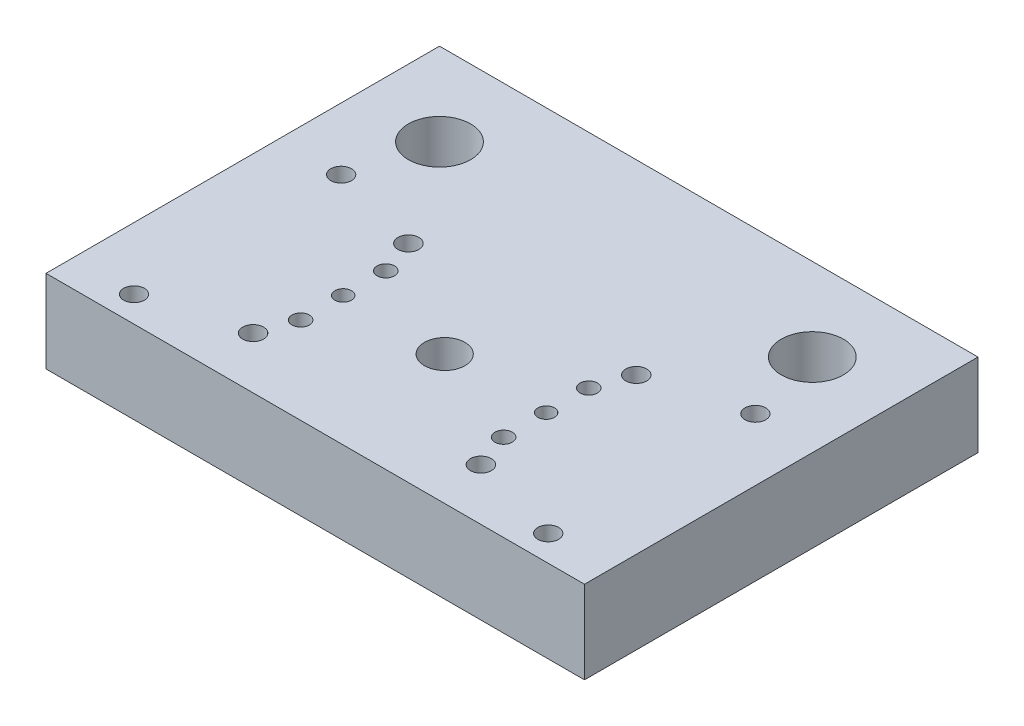
ISO-10303-21;
HEADER;
FILE_DESCRIPTION(('STEP AP214'),'2;1');
FILE_NAME('part.step','',(''),(''),'','','');
FILE_SCHEMA(('AUTOMOTIVE_DESIGN { 1 0 10303 214 1 1 1 1 }'));
ENDSEC;
DATA;
#1=APPLICATION_CONTEXT('core data for automotive mechanical design processes');
#2=APPLICATION_PROTOCOL_DEFINITION('international standard','automotive_design',2000,#1);
#3=PRODUCT_CONTEXT('',#1,'mechanical');
#4=PRODUCT('Part','Part','',(#3));
#5=PRODUCT_RELATED_PRODUCT_CATEGORY('part','',(#4));
#6=PRODUCT_DEFINITION_FORMATION('','',#4);
#7=PRODUCT_DEFINITION_CONTEXT('part definition',#1,'design');
#8=PRODUCT_DEFINITION('design','',#6,#7);
#9=PRODUCT_DEFINITION_SHAPE('','',#8);
#10=(LENGTH_UNIT() NAMED_UNIT(*) SI_UNIT(.MILLI.,.METRE.));
#11=(NAMED_UNIT(*) PLANE_ANGLE_UNIT() SI_UNIT($,.RADIAN.));
#12=(NAMED_UNIT(*) SI_UNIT($,.STERADIAN.) SOLID_ANGLE_UNIT());
#13=UNCERTAINTY_MEASURE_WITH_UNIT(LENGTH_MEASURE(1.E-05),#10,'distance_accuracy_value','');
#14=(GEOMETRIC_REPRESENTATION_CONTEXT(3) GLOBAL_UNCERTAINTY_ASSIGNED_CONTEXT((#13)) GLOBAL_UNIT_ASSIGNED_CONTEXT((#10,
#11,#12)) REPRESENTATION_CONTEXT('',''));
#15=CARTESIAN_POINT('',(0.,0.,0.));
#16=DIRECTION('',(0.,0.,1.));
#17=DIRECTION('',(1.,0.,0.));
#18=AXIS2_PLACEMENT_3D('',#15,#16,#17);
#19=CARTESIAN_POINT('',(-100.,-40.,-17.5));
#20=DIRECTION('',(0.,-1.,0.));
#21=DIRECTION('',(0.,0.,-1.));
#22=AXIS2_PLACEMENT_3D('',#19,#20,#21);
#23=CYLINDRICAL_SURFACE('',#22,5.);
#24=CARTESIAN_POINT('',(-100.,0.,-17.5));
#25=DIRECTION('',(0.,-1.,0.));
#26=DIRECTION('',(0.,0.,-1.));
#27=AXIS2_PLACEMENT_3D('',#24,#25,#26);
#28=CIRCLE('',#27,4.99999999999999);
#29=CARTESIAN_POINT('',(-100.,0.,-22.5));
#30=VERTEX_POINT('',#29);
#31=EDGE_CURVE('E175',#30,#30,#28,.T.);
#32=ORIENTED_EDGE('',*,*,#31,.F.);
#33=EDGE_LOOP('',(#32));
#34=FACE_BOUND('',#33,.T.);
#35=CARTESIAN_POINT('',(-100.,-8.1,-17.5));
#36=DIRECTION('',(0.,-1.,0.));
#37=DIRECTION('',(0.,0.,-1.));
#38=AXIS2_PLACEMENT_3D('',#35,#36,#37);
#39=CIRCLE('',#38,5.);
#40=CARTESIAN_POINT('',(-100.,-8.1,-22.5));
#41=VERTEX_POINT('',#40);
#42=EDGE_CURVE('E49',#41,#41,#39,.F.);
#43=ORIENTED_EDGE('',*,*,#42,.F.);
#44=EDGE_LOOP('',(#43));
#45=FACE_BOUND('',#44,.T.);
#46=ADVANCED_FACE('F45',(#34,#45),#23,.F.);
#47=CARTESIAN_POINT('',(-100.,-40.,82.5));
#48=DIRECTION('',(0.,-1.,0.));
#49=DIRECTION('',(0.,0.,-1.));
#50=AXIS2_PLACEMENT_3D('',#47,#48,#49);
#51=CYLINDRICAL_SURFACE('',#50,5.);
#52=CARTESIAN_POINT('',(-100.,0.,82.5));
#53=DIRECTION('',(0.,-1.,0.));
#54=DIRECTION('',(0.,0.,-1.));
#55=AXIS2_PLACEMENT_3D('',#52,#53,#54);
#56=CIRCLE('',#55,4.99999999999999);
#57=CARTESIAN_POINT('',(-100.,0.,77.5));
#58=VERTEX_POINT('',#57);
#59=EDGE_CURVE('E166',#58,#58,#56,.T.);
#60=ORIENTED_EDGE('',*,*,#59,.F.);
#61=EDGE_LOOP('',(#60));
#62=FACE_BOUND('',#61,.T.);
#63=CARTESIAN_POINT('',(-100.,-8.1,82.5));
#64=DIRECTION('',(0.,-1.,0.));
#65=DIRECTION('',(0.,0.,-1.));
#66=AXIS2_PLACEMENT_3D('',#63,#64,#65);
#67=CIRCLE('',#66,5.);
#68=CARTESIAN_POINT('',(-100.,-8.1,77.5));
#69=VERTEX_POINT('',#68);
#70=EDGE_CURVE('E145',#69,#69,#67,.F.);
#71=ORIENTED_EDGE('',*,*,#70,.F.);
#72=EDGE_LOOP('',(#71));
#73=FACE_BOUND('',#72,.T.);
#74=ADVANCED_FACE('F337',(#62,#73),#51,.F.);
#75=CARTESIAN_POINT('',(100.,-40.,82.5));
#76=DIRECTION('',(0.,-1.,0.));
#77=DIRECTION('',(0.,0.,-1.));
#78=AXIS2_PLACEMENT_3D('',#75,#76,#77);
#79=CYLINDRICAL_SURFACE('',#78,5.);
#80=CARTESIAN_POINT('',(100.,0.,82.5));
#81=DIRECTION('',(0.,-1.,0.));
#82=DIRECTION('',(0.,0.,-1.));
#83=AXIS2_PLACEMENT_3D('',#80,#81,#82);
#84=CIRCLE('',#83,4.99999999999999);
#85=CARTESIAN_POINT('',(100.,0.,77.5));
#86=VERTEX_POINT('',#85);
#87=EDGE_CURVE('E159',#86,#86,#84,.T.);
#88=ORIENTED_EDGE('',*,*,#87,.F.);
#89=EDGE_LOOP('',(#88));
#90=FACE_BOUND('',#89,.T.);
#91=CARTESIAN_POINT('',(100.,-8.1,82.5));
#92=DIRECTION('',(0.,-1.,0.));
#93=DIRECTION('',(0.,0.,-1.));
#94=AXIS2_PLACEMENT_3D('',#91,#92,#93);
#95=CIRCLE('',#94,5.);
#96=CARTESIAN_POINT('',(100.,-8.1,77.5));
#97=VERTEX_POINT('',#96);
#98=EDGE_CURVE('E141',#97,#97,#95,.F.);
#99=ORIENTED_EDGE('',*,*,#98,.F.);
#100=EDGE_LOOP('',(#99));
#101=FACE_BOUND('',#100,.T.);
#102=ADVANCED_FACE('F343',(#90,#101),#79,.F.);
#103=CARTESIAN_POINT('',(100.,-40.,-17.5));
#104=DIRECTION('',(0.,-1.,0.));
#105=DIRECTION('',(0.,0.,-1.));
#106=AXIS2_PLACEMENT_3D('',#103,#104,#105);
#107=CYLINDRICAL_SURFACE('',#106,5.);
#108=CARTESIAN_POINT('',(100.,0.,-17.5));
#109=DIRECTION('',(0.,-1.,0.));
#110=DIRECTION('',(0.,0.,-1.));
#111=AXIS2_PLACEMENT_3D('',#108,#109,#110);
#112=CIRCLE('',#111,4.99999999999999);
#113=CARTESIAN_POINT('',(100.,0.,-22.5));
#114=VERTEX_POINT('',#113);
#115=EDGE_CURVE('E153',#114,#114,#112,.T.);
#116=ORIENTED_EDGE('',*,*,#115,.F.);
#117=EDGE_LOOP('',(#116));
#118=FACE_BOUND('',#117,.T.);
#119=CARTESIAN_POINT('',(100.,-8.1,-17.5));
#120=DIRECTION('',(0.,-1.,0.));
#121=DIRECTION('',(0.,0.,-1.));
#122=AXIS2_PLACEMENT_3D('',#119,#120,#121);
#123=CIRCLE('',#122,5.);
#124=CARTESIAN_POINT('',(100.,-8.1,-22.5));
#125=VERTEX_POINT('',#124);
#126=EDGE_CURVE('E137',#125,#125,#123,.F.);
#127=ORIENTED_EDGE('',*,*,#126,.F.);
#128=EDGE_LOOP('',(#127));
#129=FACE_BOUND('',#128,.T.);
#130=ADVANCED_FACE('F335',(#118,#129),#107,.F.);
#131=CARTESIAN_POINT('',(130.,-40.,95.));
#132=DIRECTION('',(1.,0.,0.));
#133=DIRECTION('',(0.,0.,-1.));
#134=AXIS2_PLACEMENT_3D('',#131,#132,#133);
#135=PLANE('',#134);
#136=DIRECTION('',(0.,0.,-1.));
#137=VECTOR('',#136,1.);
#138=CARTESIAN_POINT('',(130.,0.,95.));
#139=LINE('',#138,#137);
#140=CARTESIAN_POINT('',(130.,0.,95.));
#141=VERTEX_POINT('',#140);
#142=CARTESIAN_POINT('',(130.,0.,-95.));
#143=VERTEX_POINT('',#142);
#144=EDGE_CURVE('E120',#141,#143,#139,.T.);
#145=ORIENTED_EDGE('',*,*,#144,.F.);
#146=DIRECTION('',(0.,1.,0.));
#147=VECTOR('',#146,1.);
#148=CARTESIAN_POINT('',(130.,-40.,95.));
#149=LINE('',#148,#147);
#150=CARTESIAN_POINT('',(130.,-40.,95.));
#151=VERTEX_POINT('',#150);
#152=EDGE_CURVE('E11',#151,#141,#149,.T.);
#153=ORIENTED_EDGE('',*,*,#152,.F.);
#154=DIRECTION('',(0.,0.,-1.));
#155=VECTOR('',#154,1.);
#156=CARTESIAN_POINT('',(130.,-40.,95.));
#157=LINE('',#156,#155);
#158=CARTESIAN_POINT('',(130.,-40.,-95.));
#159=VERTEX_POINT('',#158);
#160=EDGE_CURVE('E110',#151,#159,#157,.T.);
#161=ORIENTED_EDGE('',*,*,#160,.T.);
#162=DIRECTION('',(0.,1.,0.));
#163=VECTOR('',#162,1.);
#164=CARTESIAN_POINT('',(130.,-40.,-95.));
#165=LINE('',#164,#163);
#166=EDGE_CURVE('E90',#159,#143,#165,.T.);
#167=ORIENTED_EDGE('',*,*,#166,.T.);
#168=EDGE_LOOP('',(#145,#153,#161,#167));
#169=FACE_BOUND('',#168,.T.);
#170=ADVANCED_FACE('F47',(#169),#135,.T.);
#171=CARTESIAN_POINT('',(-130.,-40.,95.));
#172=DIRECTION('',(0.,0.,1.));
#173=DIRECTION('',(1.,0.,0.));
#174=AXIS2_PLACEMENT_3D('',#171,#172,#173);
#175=PLANE('',#174);
#176=DIRECTION('',(1.,0.,0.));
#177=VECTOR('',#176,1.);
#178=CARTESIAN_POINT('',(-130.,0.,95.));
#179=LINE('',#178,#177);
#180=CARTESIAN_POINT('',(-130.,0.,95.));
#181=VERTEX_POINT('',#180);
#182=EDGE_CURVE('E114',#181,#141,#179,.T.);
#183=ORIENTED_EDGE('',*,*,#182,.F.);
#184=DIRECTION('',(0.,1.,0.));
#185=VECTOR('',#184,1.);
#186=CARTESIAN_POINT('',(-130.,-40.,95.));
#187=LINE('',#186,#185);
#188=CARTESIAN_POINT('',(-130.,-40.,95.));
#189=VERTEX_POINT('',#188);
#190=EDGE_CURVE('E56',#189,#181,#187,.T.);
#191=ORIENTED_EDGE('',*,*,#190,.F.);
#192=DIRECTION('',(1.,0.,0.));
#193=VECTOR('',#192,1.);
#194=CARTESIAN_POINT('',(-130.,-40.,95.));
#195=LINE('',#194,#193);
#196=EDGE_CURVE('E105',#189,#151,#195,.T.);
#197=ORIENTED_EDGE('',*,*,#196,.T.);
#198=ORIENTED_EDGE('',*,*,#152,.T.);
#199=EDGE_LOOP('',(#183,#191,#197,#198));
#200=FACE_BOUND('',#199,.T.);
#201=ADVANCED_FACE('F327',(#200),#175,.T.);
#202=CARTESIAN_POINT('',(-130.,-40.,95.));
#203=DIRECTION('',(-1.,0.,0.));
#204=DIRECTION('',(0.,0.,1.));
#205=AXIS2_PLACEMENT_3D('',#202,#203,#204);
#206=PLANE('',#205);
#207=DIRECTION('',(0.,0.,1.));
#208=VECTOR('',#207,1.);
#209=CARTESIAN_POINT('',(-130.,0.,95.));
#210=LINE('',#209,#208);
#211=CARTESIAN_POINT('',(-130.,0.,-95.));
#212=VERTEX_POINT('',#211);
#213=EDGE_CURVE('E98',#212,#181,#210,.T.);
#214=ORIENTED_EDGE('',*,*,#213,.F.);
#215=DIRECTION('',(0.,1.,0.));
#216=VECTOR('',#215,1.);
#217=CARTESIAN_POINT('',(-130.,-40.,-95.));
#218=LINE('',#217,#216);
#219=CARTESIAN_POINT('',(-130.,-40.,-95.));
#220=VERTEX_POINT('',#219);
#221=EDGE_CURVE('E93',#220,#212,#218,.T.);
#222=ORIENTED_EDGE('',*,*,#221,.F.);
#223=DIRECTION('',(0.,0.,1.));
#224=VECTOR('',#223,1.);
#225=CARTESIAN_POINT('',(-130.,-40.,95.));
#226=LINE('',#225,#224);
#227=EDGE_CURVE('E96',#220,#189,#226,.T.);
#228=ORIENTED_EDGE('',*,*,#227,.T.);
#229=ORIENTED_EDGE('',*,*,#190,.T.);
#230=EDGE_LOOP('',(#214,#222,#228,#229));
#231=FACE_BOUND('',#230,.T.);
#232=ADVANCED_FACE('F95',(#231),#206,.T.);
#233=CARTESIAN_POINT('',(-130.,-40.,-95.));
#234=DIRECTION('',(0.,0.,-1.));
#235=DIRECTION('',(-1.,0.,0.));
#236=AXIS2_PLACEMENT_3D('',#233,#234,#235);
#237=PLANE('',#236);
#238=DIRECTION('',(-1.,0.,0.));
#239=VECTOR('',#238,1.);
#240=CARTESIAN_POINT('',(-130.,0.,-95.));
#241=LINE('',#240,#239);
#242=EDGE_CURVE('E124',#143,#212,#241,.T.);
#243=ORIENTED_EDGE('',*,*,#242,.F.);
#244=ORIENTED_EDGE('',*,*,#166,.F.);
#245=DIRECTION('',(-1.,0.,0.));
#246=VECTOR('',#245,1.);
#247=CARTESIAN_POINT('',(-130.,-40.,-95.));
#248=LINE('',#247,#246);
#249=EDGE_CURVE('E104',#159,#220,#248,.T.);
#250=ORIENTED_EDGE('',*,*,#249,.T.);
#251=ORIENTED_EDGE('',*,*,#221,.T.);
#252=EDGE_LOOP('',(#243,#244,#250,#251));
#253=FACE_BOUND('',#252,.T.);
#254=ADVANCED_FACE('F108',(#253),#237,.T.);
#255=CARTESIAN_POINT('',(0.,-40.,0.));
#256=DIRECTION('',(0.,-1.,0.));
#257=DIRECTION('',(0.,0.,-1.));
#258=AXIS2_PLACEMENT_3D('',#255,#256,#257);
#259=PLANE('',#258);
#260=CARTESIAN_POINT('',(-100.,-40.,-17.5));
#261=DIRECTION('',(0.,-1.,0.));
#262=DIRECTION('',(0.,0.,-1.));
#263=AXIS2_PLACEMENT_3D('',#260,#261,#262);
#264=CIRCLE('',#263,8.50000000000001);
#265=CARTESIAN_POINT('',(-100.,-40.,-26.));
#266=VERTEX_POINT('',#265);
#267=EDGE_CURVE('E440',#266,#266,#264,.T.);
#268=ORIENTED_EDGE('',*,*,#267,.F.);
#269=EDGE_LOOP('',(#268));
#270=FACE_BOUND('',#269,.T.);
#271=CARTESIAN_POINT('',(100.,-40.,-17.5));
#272=DIRECTION('',(0.,-1.,0.));
#273=DIRECTION('',(0.,0.,-1.));
#274=AXIS2_PLACEMENT_3D('',#271,#272,#273);
#275=CIRCLE('',#274,8.50000000000001);
#276=CARTESIAN_POINT('',(100.,-40.,-26.));
#277=VERTEX_POINT('',#276);
#278=EDGE_CURVE('E444',#277,#277,#275,.T.);
#279=ORIENTED_EDGE('',*,*,#278,.F.);
#280=EDGE_LOOP('',(#279));
#281=FACE_BOUND('',#280,.T.);
#282=CARTESIAN_POINT('',(100.,-40.,82.5));
#283=DIRECTION('',(0.,-1.,0.));
#284=DIRECTION('',(0.,0.,-1.));
#285=AXIS2_PLACEMENT_3D('',#282,#283,#284);
#286=CIRCLE('',#285,8.50000000000001);
#287=CARTESIAN_POINT('',(100.,-40.,74.));
#288=VERTEX_POINT('',#287);
#289=EDGE_CURVE('E448',#288,#288,#286,.T.);
#290=ORIENTED_EDGE('',*,*,#289,.F.);
#291=EDGE_LOOP('',(#290));
#292=FACE_BOUND('',#291,.T.);
#293=CARTESIAN_POINT('',(-100.,-40.,82.5));
#294=DIRECTION('',(0.,-1.,0.));
#295=DIRECTION('',(0.,0.,-1.));
#296=AXIS2_PLACEMENT_3D('',#293,#294,#295);
#297=CIRCLE('',#296,8.50000000000001);
#298=CARTESIAN_POINT('',(-100.,-40.,74.));
#299=VERTEX_POINT('',#298);
#300=EDGE_CURVE('E169',#299,#299,#297,.T.);
#301=ORIENTED_EDGE('',*,*,#300,.F.);
#302=EDGE_LOOP('',(#301));
#303=FACE_BOUND('',#302,.T.);
#304=CARTESIAN_POINT('',(49.,-40.,32.5));
#305=DIRECTION('',(0.,-1.,0.));
#306=DIRECTION('',(0.,0.,-1.));
#307=AXIS2_PLACEMENT_3D('',#304,#305,#306);
#308=CIRCLE('',#307,4.);
#309=CARTESIAN_POINT('',(49.,-40.,28.5));
#310=VERTEX_POINT('',#309);
#311=EDGE_CURVE('E179',#310,#310,#308,.T.);
#312=ORIENTED_EDGE('',*,*,#311,.F.);
#313=EDGE_LOOP('',(#312));
#314=FACE_BOUND('',#313,.T.);
#315=CARTESIAN_POINT('',(-49.,-40.,32.5));
#316=DIRECTION('',(0.,-1.,0.));
#317=DIRECTION('',(0.,0.,-1.));
#318=AXIS2_PLACEMENT_3D('',#315,#316,#317);
#319=CIRCLE('',#318,4.);
#320=CARTESIAN_POINT('',(-49.,-40.,28.5));
#321=VERTEX_POINT('',#320);
#322=EDGE_CURVE('E187',#321,#321,#319,.T.);
#323=ORIENTED_EDGE('',*,*,#322,.F.);
#324=EDGE_LOOP('',(#323));
#325=FACE_BOUND('',#324,.T.);
#326=CARTESIAN_POINT('',(49.,-40.,11.95));
#327=DIRECTION('',(0.,-1.,0.));
#328=DIRECTION('',(0.,0.,-1.));
#329=AXIS2_PLACEMENT_3D('',#326,#327,#328);
#330=CIRCLE('',#329,7.5);
#331=CARTESIAN_POINT('',(49.,-40.,4.44999999999999));
#332=VERTEX_POINT('',#331);
#333=EDGE_CURVE('E195',#332,#332,#330,.T.);
#334=ORIENTED_EDGE('',*,*,#333,.F.);
#335=EDGE_LOOP('',(#334));
#336=FACE_BOUND('',#335,.T.);
#337=CARTESIAN_POINT('',(49.,-40.,53.05));
#338=DIRECTION('',(0.,-1.,0.));
#339=DIRECTION('',(0.,0.,-1.));
#340=AXIS2_PLACEMENT_3D('',#337,#338,#339);
#341=CIRCLE('',#340,7.5);
#342=CARTESIAN_POINT('',(49.,-40.,45.55));
#343=VERTEX_POINT('',#342);
#344=EDGE_CURVE('E211',#343,#343,#341,.T.);
#345=ORIENTED_EDGE('',*,*,#344,.F.);
#346=EDGE_LOOP('',(#345));
#347=FACE_BOUND('',#346,.T.);
#348=CARTESIAN_POINT('',(-49.,-40.,53.05));
#349=DIRECTION('',(0.,-1.,0.));
#350=DIRECTION('',(0.,0.,-1.));
#351=AXIS2_PLACEMENT_3D('',#348,#349,#350);
#352=CIRCLE('',#351,7.5);
#353=CARTESIAN_POINT('',(-49.,-40.,45.55));
#354=VERTEX_POINT('',#353);
#355=EDGE_CURVE('E227',#354,#354,#352,.T.);
#356=ORIENTED_EDGE('',*,*,#355,.F.);
#357=EDGE_LOOP('',(#356));
#358=FACE_BOUND('',#357,.T.);
#359=CARTESIAN_POINT('',(-49.,-40.,11.95));
#360=DIRECTION('',(0.,-1.,0.));
#361=DIRECTION('',(0.,0.,-1.));
#362=AXIS2_PLACEMENT_3D('',#359,#360,#361);
#363=CIRCLE('',#362,7.5);
#364=CARTESIAN_POINT('',(-49.,-40.,4.44999999999999));
#365=VERTEX_POINT('',#364);
#366=EDGE_CURVE('E243',#365,#365,#363,.T.);
#367=ORIENTED_EDGE('',*,*,#366,.F.);
#368=EDGE_LOOP('',(#367));
#369=FACE_BOUND('',#368,.T.);
#370=CARTESIAN_POINT('',(0.,-40.,32.5));
#371=DIRECTION('',(0.,-1.,0.));
#372=DIRECTION('',(0.,0.,-1.));
#373=AXIS2_PLACEMENT_3D('',#370,#371,#372);
#374=CIRCLE('',#373,9.77054898648711);
#375=CARTESIAN_POINT('',(0.,-40.,22.7294510135129));
#376=VERTEX_POINT('',#375);
#377=EDGE_CURVE('E259',#376,#376,#374,.T.);
#378=ORIENTED_EDGE('',*,*,#377,.F.);
#379=EDGE_LOOP('',(#378));
#380=FACE_BOUND('',#379,.T.);
#381=CARTESIAN_POINT('',(-55.,-40.,-5.00000000000002));
#382=DIRECTION('',(0.,-1.,0.));
#383=DIRECTION('',(0.,0.,-1.));
#384=AXIS2_PLACEMENT_3D('',#381,#382,#383);
#385=CIRCLE('',#384,5.05);
#386=CARTESIAN_POINT('',(-55.,-40.,-10.05));
#387=VERTEX_POINT('',#386);
#388=EDGE_CURVE('E285',#387,#387,#385,.T.);
#389=ORIENTED_EDGE('',*,*,#388,.F.);
#390=EDGE_LOOP('',(#389));
#391=FACE_BOUND('',#390,.T.);
#392=CARTESIAN_POINT('',(55.,-40.,-5.));
#393=DIRECTION('',(0.,-1.,0.));
#394=DIRECTION('',(0.,0.,-1.));
#395=AXIS2_PLACEMENT_3D('',#392,#393,#394);
#396=CIRCLE('',#395,5.05);
#397=CARTESIAN_POINT('',(55.,-40.,-10.05));
#398=VERTEX_POINT('',#397);
#399=EDGE_CURVE('E277',#398,#398,#396,.T.);
#400=ORIENTED_EDGE('',*,*,#399,.F.);
#401=EDGE_LOOP('',(#400));
#402=FACE_BOUND('',#401,.T.);
#403=CARTESIAN_POINT('',(55.,-40.,70.));
#404=DIRECTION('',(0.,-1.,0.));
#405=DIRECTION('',(0.,0.,-1.));
#406=AXIS2_PLACEMENT_3D('',#403,#404,#405);
#407=CIRCLE('',#406,5.05);
#408=CARTESIAN_POINT('',(55.,-40.,64.95));
#409=VERTEX_POINT('',#408);
#410=EDGE_CURVE('E268',#409,#409,#407,.T.);
#411=ORIENTED_EDGE('',*,*,#410,.F.);
#412=EDGE_LOOP('',(#411));
#413=FACE_BOUND('',#412,.T.);
#414=CARTESIAN_POINT('',(-55.,-40.,70.));
#415=DIRECTION('',(0.,-1.,0.));
#416=DIRECTION('',(0.,0.,-1.));
#417=AXIS2_PLACEMENT_3D('',#414,#415,#416);
#418=CIRCLE('',#417,5.05);
#419=CARTESIAN_POINT('',(-55.,-40.,64.95));
#420=VERTEX_POINT('',#419);
#421=EDGE_CURVE('E272',#420,#420,#418,.T.);
#422=ORIENTED_EDGE('',*,*,#421,.F.);
#423=EDGE_LOOP('',(#422));
#424=FACE_BOUND('',#423,.T.);
#425=CARTESIAN_POINT('',(-90.,-40.,-55.));
#426=DIRECTION('',(0.,1.,0.));
#427=DIRECTION('',(0.,0.,1.));
#428=AXIS2_PLACEMENT_3D('',#425,#426,#427);
#429=CIRCLE('',#428,15.);
#430=CARTESIAN_POINT('',(-90.,-40.,-40.));
#431=VERTEX_POINT('',#430);
#432=EDGE_CURVE('E125',#431,#431,#429,.T.);
#433=ORIENTED_EDGE('',*,*,#432,.T.);
#434=EDGE_LOOP('',(#433));
#435=FACE_BOUND('',#434,.T.);
#436=CARTESIAN_POINT('',(90.,-40.,-55.));
#437=DIRECTION('',(0.,1.,0.));
#438=DIRECTION('',(0.,0.,1.));
#439=AXIS2_PLACEMENT_3D('',#436,#437,#438);
#440=CIRCLE('',#439,15.);
#441=CARTESIAN_POINT('',(90.,-40.,-40.));
#442=VERTEX_POINT('',#441);
#443=EDGE_CURVE('E296',#442,#442,#440,.T.);
#444=ORIENTED_EDGE('',*,*,#443,.T.);
#445=EDGE_LOOP('',(#444));
#446=FACE_BOUND('',#445,.T.);
#447=ORIENTED_EDGE('',*,*,#160,.F.);
#448=ORIENTED_EDGE('',*,*,#196,.F.);
#449=ORIENTED_EDGE('',*,*,#227,.F.);
#450=ORIENTED_EDGE('',*,*,#249,.F.);
#451=EDGE_LOOP('',(#447,#448,#449,#450));
#452=FACE_BOUND('',#451,.T.);
#453=ADVANCED_FACE('F103',(#270,#281,#292,#303,#314,#325,#336,#347,#358,#369,#380,#391,#402,
#413,#424,#435,#446,#452),#259,.T.);
#454=CARTESIAN_POINT('',(0.,0.,0.));
#455=DIRECTION('',(0.,-1.,0.));
#456=DIRECTION('',(0.,0.,-1.));
#457=AXIS2_PLACEMENT_3D('',#454,#455,#456);
#458=PLANE('',#457);
#459=ORIENTED_EDGE('',*,*,#115,.T.);
#460=EDGE_LOOP('',(#459));
#461=FACE_BOUND('',#460,.T.);
#462=ORIENTED_EDGE('',*,*,#87,.T.);
#463=EDGE_LOOP('',(#462));
#464=FACE_BOUND('',#463,.T.);
#465=ORIENTED_EDGE('',*,*,#59,.T.);
#466=EDGE_LOOP('',(#465));
#467=FACE_BOUND('',#466,.T.);
#468=ORIENTED_EDGE('',*,*,#31,.T.);
#469=EDGE_LOOP('',(#468));
#470=FACE_BOUND('',#469,.T.);
#471=CARTESIAN_POINT('',(49.,0.,32.5));
#472=DIRECTION('',(0.,-1.,0.));
#473=DIRECTION('',(0.,0.,-1.));
#474=AXIS2_PLACEMENT_3D('',#471,#472,#473);
#475=CIRCLE('',#474,3.99999999999999);
#476=CARTESIAN_POINT('',(49.,0.,28.5));
#477=VERTEX_POINT('',#476);
#478=EDGE_CURVE('E183',#477,#477,#475,.T.);
#479=ORIENTED_EDGE('',*,*,#478,.T.);
#480=EDGE_LOOP('',(#479));
#481=FACE_BOUND('',#480,.T.);
#482=CARTESIAN_POINT('',(-49.,0.,32.5));
#483=DIRECTION('',(0.,-1.,0.));
#484=DIRECTION('',(0.,0.,-1.));
#485=AXIS2_PLACEMENT_3D('',#482,#483,#484);
#486=CIRCLE('',#485,3.99999999999999);
#487=CARTESIAN_POINT('',(-49.,0.,28.5));
#488=VERTEX_POINT('',#487);
#489=EDGE_CURVE('E191',#488,#488,#486,.T.);
#490=ORIENTED_EDGE('',*,*,#489,.T.);
#491=EDGE_LOOP('',(#490));
#492=FACE_BOUND('',#491,.T.);
#493=CARTESIAN_POINT('',(49.,0.,11.95));
#494=DIRECTION('',(0.,-1.,0.));
#495=DIRECTION('',(0.,0.,-1.));
#496=AXIS2_PLACEMENT_3D('',#493,#494,#495);
#497=CIRCLE('',#496,4.19999999999999);
#498=CARTESIAN_POINT('',(49.,0.,7.75));
#499=VERTEX_POINT('',#498);
#500=EDGE_CURVE('E207',#499,#499,#497,.T.);
#501=ORIENTED_EDGE('',*,*,#500,.T.);
#502=EDGE_LOOP('',(#501));
#503=FACE_BOUND('',#502,.T.);
#504=CARTESIAN_POINT('',(49.,0.,53.05));
#505=DIRECTION('',(0.,-1.,0.));
#506=DIRECTION('',(0.,0.,-1.));
#507=AXIS2_PLACEMENT_3D('',#504,#505,#506);
#508=CIRCLE('',#507,4.19999999999999);
#509=CARTESIAN_POINT('',(49.,0.,48.85));
#510=VERTEX_POINT('',#509);
#511=EDGE_CURVE('E223',#510,#510,#508,.T.);
#512=ORIENTED_EDGE('',*,*,#511,.T.);
#513=EDGE_LOOP('',(#512));
#514=FACE_BOUND('',#513,.T.);
#515=CARTESIAN_POINT('',(-49.,0.,53.05));
#516=DIRECTION('',(0.,-1.,0.));
#517=DIRECTION('',(0.,0.,-1.));
#518=AXIS2_PLACEMENT_3D('',#515,#516,#517);
#519=CIRCLE('',#518,4.19999999999999);
#520=CARTESIAN_POINT('',(-49.,0.,48.85));
#521=VERTEX_POINT('',#520);
#522=EDGE_CURVE('E239',#521,#521,#519,.T.);
#523=ORIENTED_EDGE('',*,*,#522,.T.);
#524=EDGE_LOOP('',(#523));
#525=FACE_BOUND('',#524,.T.);
#526=CARTESIAN_POINT('',(-49.,0.,11.95));
#527=DIRECTION('',(0.,-1.,0.));
#528=DIRECTION('',(0.,0.,-1.));
#529=AXIS2_PLACEMENT_3D('',#526,#527,#528);
#530=CIRCLE('',#529,4.19999999999999);
#531=CARTESIAN_POINT('',(-49.,0.,7.75));
#532=VERTEX_POINT('',#531);
#533=EDGE_CURVE('E255',#532,#532,#530,.T.);
#534=ORIENTED_EDGE('',*,*,#533,.T.);
#535=EDGE_LOOP('',(#534));
#536=FACE_BOUND('',#535,.T.);
#537=CARTESIAN_POINT('',(0.,0.,32.5));
#538=DIRECTION('',(0.,-1.,0.));
#539=DIRECTION('',(0.,0.,-1.));
#540=AXIS2_PLACEMENT_3D('',#537,#538,#539);
#541=CIRCLE('',#540,9.77054898648711);
#542=CARTESIAN_POINT('',(0.,0.,22.7294510135129));
#543=VERTEX_POINT('',#542);
#544=EDGE_CURVE('E260',#543,#543,#541,.T.);
#545=ORIENTED_EDGE('',*,*,#544,.T.);
#546=EDGE_LOOP('',(#545));
#547=FACE_BOUND('',#546,.T.);
#548=CARTESIAN_POINT('',(-55.,0.,-5.00000000000002));
#549=DIRECTION('',(0.,-1.,0.));
#550=DIRECTION('',(0.,0.,-1.));
#551=AXIS2_PLACEMENT_3D('',#548,#549,#550);
#552=CIRCLE('',#551,5.05);
#553=CARTESIAN_POINT('',(-55.,0.,-10.05));
#554=VERTEX_POINT('',#553);
#555=EDGE_CURVE('E264',#554,#554,#552,.T.);
#556=ORIENTED_EDGE('',*,*,#555,.T.);
#557=EDGE_LOOP('',(#556));
#558=FACE_BOUND('',#557,.T.);
#559=CARTESIAN_POINT('',(55.,0.,-5.));
#560=DIRECTION('',(0.,-1.,0.));
#561=DIRECTION('',(0.,0.,-1.));
#562=AXIS2_PLACEMENT_3D('',#559,#560,#561);
#563=CIRCLE('',#562,5.05);
#564=CARTESIAN_POINT('',(55.,0.,-10.05));
#565=VERTEX_POINT('',#564);
#566=EDGE_CURVE('E281',#565,#565,#563,.T.);
#567=ORIENTED_EDGE('',*,*,#566,.T.);
#568=EDGE_LOOP('',(#567));
#569=FACE_BOUND('',#568,.T.);
#570=CARTESIAN_POINT('',(55.,0.,70.));
#571=DIRECTION('',(0.,-1.,0.));
#572=DIRECTION('',(0.,0.,-1.));
#573=AXIS2_PLACEMENT_3D('',#570,#571,#572);
#574=CIRCLE('',#573,5.05);
#575=CARTESIAN_POINT('',(55.,0.,64.95));
#576=VERTEX_POINT('',#575);
#577=EDGE_CURVE('E273',#576,#576,#574,.T.);
#578=ORIENTED_EDGE('',*,*,#577,.T.);
#579=EDGE_LOOP('',(#578));
#580=FACE_BOUND('',#579,.T.);
#581=CARTESIAN_POINT('',(-55.,0.,70.));
#582=DIRECTION('',(0.,-1.,0.));
#583=DIRECTION('',(0.,0.,-1.));
#584=AXIS2_PLACEMENT_3D('',#581,#582,#583);
#585=CIRCLE('',#584,5.05);
#586=CARTESIAN_POINT('',(-55.,0.,64.95));
#587=VERTEX_POINT('',#586);
#588=EDGE_CURVE('E292',#587,#587,#585,.T.);
#589=ORIENTED_EDGE('',*,*,#588,.T.);
#590=EDGE_LOOP('',(#589));
#591=FACE_BOUND('',#590,.T.);
#592=CARTESIAN_POINT('',(-90.,0.,-55.));
#593=DIRECTION('',(0.,1.,0.));
#594=DIRECTION('',(0.,0.,1.));
#595=AXIS2_PLACEMENT_3D('',#592,#593,#594);
#596=CIRCLE('',#595,15.);
#597=CARTESIAN_POINT('',(-90.,0.,-40.));
#598=VERTEX_POINT('',#597);
#599=EDGE_CURVE('E303',#598,#598,#596,.T.);
#600=ORIENTED_EDGE('',*,*,#599,.F.);
#601=EDGE_LOOP('',(#600));
#602=FACE_BOUND('',#601,.T.);
#603=CARTESIAN_POINT('',(90.,0.,-55.));
#604=DIRECTION('',(0.,1.,0.));
#605=DIRECTION('',(0.,0.,1.));
#606=AXIS2_PLACEMENT_3D('',#603,#604,#605);
#607=CIRCLE('',#606,15.);
#608=CARTESIAN_POINT('',(90.,0.,-40.));
#609=VERTEX_POINT('',#608);
#610=EDGE_CURVE('E307',#609,#609,#607,.T.);
#611=ORIENTED_EDGE('',*,*,#610,.F.);
#612=EDGE_LOOP('',(#611));
#613=FACE_BOUND('',#612,.T.);
#614=ORIENTED_EDGE('',*,*,#144,.T.);
#615=ORIENTED_EDGE('',*,*,#242,.T.);
#616=ORIENTED_EDGE('',*,*,#213,.T.);
#617=ORIENTED_EDGE('',*,*,#182,.T.);
#618=EDGE_LOOP('',(#614,#615,#616,#617));
#619=FACE_BOUND('',#618,.T.);
#620=ADVANCED_FACE('F320',(#461,#464,#467,#470,#481,#492,#503,#514,#525,#536,#547,#558,#569,
#580,#591,#602,#613,#619),#458,.F.);
#621=CARTESIAN_POINT('',(90.,-40.,-55.));
#622=DIRECTION('',(0.,1.,0.));
#623=DIRECTION('',(0.,0.,1.));
#624=AXIS2_PLACEMENT_3D('',#621,#622,#623);
#625=CYLINDRICAL_SURFACE('',#624,15.);
#626=ORIENTED_EDGE('',*,*,#443,.F.);
#627=EDGE_LOOP('',(#626));
#628=FACE_BOUND('',#627,.T.);
#629=ORIENTED_EDGE('',*,*,#610,.T.);
#630=EDGE_LOOP('',(#629));
#631=FACE_BOUND('',#630,.T.);
#632=ADVANCED_FACE('F316',(#628,#631),#625,.F.);
#633=CARTESIAN_POINT('',(-90.,-40.,-55.));
#634=DIRECTION('',(0.,1.,0.));
#635=DIRECTION('',(0.,0.,1.));
#636=AXIS2_PLACEMENT_3D('',#633,#634,#635);
#637=CYLINDRICAL_SURFACE('',#636,15.);
#638=ORIENTED_EDGE('',*,*,#432,.F.);
#639=EDGE_LOOP('',(#638));
#640=FACE_BOUND('',#639,.T.);
#641=ORIENTED_EDGE('',*,*,#599,.T.);
#642=EDGE_LOOP('',(#641));
#643=FACE_BOUND('',#642,.T.);
#644=ADVANCED_FACE('F319',(#640,#643),#637,.F.);
#645=CARTESIAN_POINT('',(-55.,0.,70.));
#646=DIRECTION('',(0.,-1.,0.));
#647=DIRECTION('',(0.,0.,-1.));
#648=AXIS2_PLACEMENT_3D('',#645,#646,#647);
#649=CYLINDRICAL_SURFACE('',#648,5.05);
#650=ORIENTED_EDGE('',*,*,#588,.F.);
#651=EDGE_LOOP('',(#650));
#652=FACE_BOUND('',#651,.T.);
#653=ORIENTED_EDGE('',*,*,#421,.T.);
#654=EDGE_LOOP('',(#653));
#655=FACE_BOUND('',#654,.T.);
#656=ADVANCED_FACE('F416',(#652,#655),#649,.F.);
#657=CARTESIAN_POINT('',(55.,0.,70.));
#658=DIRECTION('',(0.,-1.,0.));
#659=DIRECTION('',(0.,0.,-1.));
#660=AXIS2_PLACEMENT_3D('',#657,#658,#659);
#661=CYLINDRICAL_SURFACE('',#660,5.05);
#662=ORIENTED_EDGE('',*,*,#577,.F.);
#663=EDGE_LOOP('',(#662));
#664=FACE_BOUND('',#663,.T.);
#665=ORIENTED_EDGE('',*,*,#410,.T.);
#666=EDGE_LOOP('',(#665));
#667=FACE_BOUND('',#666,.T.);
#668=ADVANCED_FACE('F412',(#664,#667),#661,.F.);
#669=CARTESIAN_POINT('',(55.,0.,-5.));
#670=DIRECTION('',(0.,-1.,0.));
#671=DIRECTION('',(0.,0.,-1.));
#672=AXIS2_PLACEMENT_3D('',#669,#670,#671);
#673=CYLINDRICAL_SURFACE('',#672,5.05);
#674=ORIENTED_EDGE('',*,*,#566,.F.);
#675=EDGE_LOOP('',(#674));
#676=FACE_BOUND('',#675,.T.);
#677=ORIENTED_EDGE('',*,*,#399,.T.);
#678=EDGE_LOOP('',(#677));
#679=FACE_BOUND('',#678,.T.);
#680=ADVANCED_FACE('F415',(#676,#679),#673,.F.);
#681=CARTESIAN_POINT('',(-55.,0.,-5.00000000000002));
#682=DIRECTION('',(0.,-1.,0.));
#683=DIRECTION('',(0.,0.,-1.));
#684=AXIS2_PLACEMENT_3D('',#681,#682,#683);
#685=CYLINDRICAL_SURFACE('',#684,5.05);
#686=ORIENTED_EDGE('',*,*,#555,.F.);
#687=EDGE_LOOP('',(#686));
#688=FACE_BOUND('',#687,.T.);
#689=ORIENTED_EDGE('',*,*,#388,.T.);
#690=EDGE_LOOP('',(#689));
#691=FACE_BOUND('',#690,.T.);
#692=ADVANCED_FACE('F410',(#688,#691),#685,.F.);
#693=CARTESIAN_POINT('',(0.,0.,32.5));
#694=DIRECTION('',(0.,-1.,0.));
#695=DIRECTION('',(0.,0.,-1.));
#696=AXIS2_PLACEMENT_3D('',#693,#694,#695);
#697=CYLINDRICAL_SURFACE('',#696,9.77054898648711);
#698=ORIENTED_EDGE('',*,*,#544,.F.);
#699=EDGE_LOOP('',(#698));
#700=FACE_BOUND('',#699,.T.);
#701=ORIENTED_EDGE('',*,*,#377,.T.);
#702=EDGE_LOOP('',(#701));
#703=FACE_BOUND('',#702,.T.);
#704=ADVANCED_FACE('F406',(#700,#703),#697,.F.);
#705=CARTESIAN_POINT('',(-49.,-40.,11.95));
#706=DIRECTION('',(0.,-1.,0.));
#707=DIRECTION('',(0.,0.,-1.));
#708=AXIS2_PLACEMENT_3D('',#705,#706,#707);
#709=CYLINDRICAL_SURFACE('',#708,4.2);
#710=ORIENTED_EDGE('',*,*,#533,.F.);
#711=EDGE_LOOP('',(#710));
#712=FACE_BOUND('',#711,.T.);
#713=CARTESIAN_POINT('',(-49.,-31.4,11.95));
#714=DIRECTION('',(0.,-1.,0.));
#715=DIRECTION('',(0.,0.,-1.));
#716=AXIS2_PLACEMENT_3D('',#713,#714,#715);
#717=CIRCLE('',#716,4.2);
#718=CARTESIAN_POINT('',(-49.,-31.4,7.74999999999999));
#719=VERTEX_POINT('',#718);
#720=EDGE_CURVE('E251',#719,#719,#717,.T.);
#721=ORIENTED_EDGE('',*,*,#720,.T.);
#722=EDGE_LOOP('',(#721));
#723=FACE_BOUND('',#722,.T.);
#724=ADVANCED_FACE('F402',(#712,#723),#709,.F.);
#725=CARTESIAN_POINT('',(-44.8,-31.4,11.95));
#726=DIRECTION('',(0.,1.,0.));
#727=DIRECTION('',(0.,0.,1.));
#728=AXIS2_PLACEMENT_3D('',#725,#726,#727);
#729=PLANE('',#728);
#730=ORIENTED_EDGE('',*,*,#720,.F.);
#731=EDGE_LOOP('',(#730));
#732=FACE_BOUND('',#731,.T.);
#733=CARTESIAN_POINT('',(-49.,-31.4,11.95));
#734=DIRECTION('',(0.,-1.,0.));
#735=DIRECTION('',(0.,0.,-1.));
#736=AXIS2_PLACEMENT_3D('',#733,#734,#735);
#737=CIRCLE('',#736,7.5);
#738=CARTESIAN_POINT('',(-49.,-31.4,4.44999999999999));
#739=VERTEX_POINT('',#738);
#740=EDGE_CURVE('E247',#739,#739,#737,.T.);
#741=ORIENTED_EDGE('',*,*,#740,.T.);
#742=EDGE_LOOP('',(#741));
#743=FACE_BOUND('',#742,.T.);
#744=ADVANCED_FACE('F398',(#732,#743),#729,.F.);
#745=CARTESIAN_POINT('',(-49.,-40.,11.95));
#746=DIRECTION('',(0.,-1.,0.));
#747=DIRECTION('',(0.,0.,-1.));
#748=AXIS2_PLACEMENT_3D('',#745,#746,#747);
#749=CYLINDRICAL_SURFACE('',#748,7.5);
#750=ORIENTED_EDGE('',*,*,#740,.F.);
#751=EDGE_LOOP('',(#750));
#752=FACE_BOUND('',#751,.T.);
#753=ORIENTED_EDGE('',*,*,#366,.T.);
#754=EDGE_LOOP('',(#753));
#755=FACE_BOUND('',#754,.T.);
#756=ADVANCED_FACE('F394',(#752,#755),#749,.F.);
#757=CARTESIAN_POINT('',(-49.,-40.,53.05));
#758=DIRECTION('',(0.,-1.,0.));
#759=DIRECTION('',(0.,0.,-1.));
#760=AXIS2_PLACEMENT_3D('',#757,#758,#759);
#761=CYLINDRICAL_SURFACE('',#760,4.2);
#762=ORIENTED_EDGE('',*,*,#522,.F.);
#763=EDGE_LOOP('',(#762));
#764=FACE_BOUND('',#763,.T.);
#765=CARTESIAN_POINT('',(-49.,-31.4,53.05));
#766=DIRECTION('',(0.,-1.,0.));
#767=DIRECTION('',(0.,0.,-1.));
#768=AXIS2_PLACEMENT_3D('',#765,#766,#767);
#769=CIRCLE('',#768,4.2);
#770=CARTESIAN_POINT('',(-49.,-31.4,48.85));
#771=VERTEX_POINT('',#770);
#772=EDGE_CURVE('E235',#771,#771,#769,.T.);
#773=ORIENTED_EDGE('',*,*,#772,.T.);
#774=EDGE_LOOP('',(#773));
#775=FACE_BOUND('',#774,.T.);
#776=ADVANCED_FACE('F390',(#764,#775),#761,.F.);
#777=CARTESIAN_POINT('',(-44.8,-31.4,53.05));
#778=DIRECTION('',(0.,1.,0.));
#779=DIRECTION('',(0.,0.,1.));
#780=AXIS2_PLACEMENT_3D('',#777,#778,#779);
#781=PLANE('',#780);
#782=ORIENTED_EDGE('',*,*,#772,.F.);
#783=EDGE_LOOP('',(#782));
#784=FACE_BOUND('',#783,.T.);
#785=CARTESIAN_POINT('',(-49.,-31.4,53.05));
#786=DIRECTION('',(0.,-1.,0.));
#787=DIRECTION('',(0.,0.,-1.));
#788=AXIS2_PLACEMENT_3D('',#785,#786,#787);
#789=CIRCLE('',#788,7.5);
#790=CARTESIAN_POINT('',(-49.,-31.4,45.55));
#791=VERTEX_POINT('',#790);
#792=EDGE_CURVE('E231',#791,#791,#789,.T.);
#793=ORIENTED_EDGE('',*,*,#792,.T.);
#794=EDGE_LOOP('',(#793));
#795=FACE_BOUND('',#794,.T.);
#796=ADVANCED_FACE('F386',(#784,#795),#781,.F.);
#797=CARTESIAN_POINT('',(-49.,-40.,53.05));
#798=DIRECTION('',(0.,-1.,0.));
#799=DIRECTION('',(0.,0.,-1.));
#800=AXIS2_PLACEMENT_3D('',#797,#798,#799);
#801=CYLINDRICAL_SURFACE('',#800,7.5);
#802=ORIENTED_EDGE('',*,*,#792,.F.);
#803=EDGE_LOOP('',(#802));
#804=FACE_BOUND('',#803,.T.);
#805=ORIENTED_EDGE('',*,*,#355,.T.);
#806=EDGE_LOOP('',(#805));
#807=FACE_BOUND('',#806,.T.);
#808=ADVANCED_FACE('F382',(#804,#807),#801,.F.);
#809=CARTESIAN_POINT('',(49.,-40.,53.05));
#810=DIRECTION('',(0.,-1.,0.));
#811=DIRECTION('',(0.,0.,-1.));
#812=AXIS2_PLACEMENT_3D('',#809,#810,#811);
#813=CYLINDRICAL_SURFACE('',#812,4.2);
#814=ORIENTED_EDGE('',*,*,#511,.F.);
#815=EDGE_LOOP('',(#814));
#816=FACE_BOUND('',#815,.T.);
#817=CARTESIAN_POINT('',(49.,-31.4,53.05));
#818=DIRECTION('',(0.,-1.,0.));
#819=DIRECTION('',(0.,0.,-1.));
#820=AXIS2_PLACEMENT_3D('',#817,#818,#819);
#821=CIRCLE('',#820,4.2);
#822=CARTESIAN_POINT('',(49.,-31.4,48.85));
#823=VERTEX_POINT('',#822);
#824=EDGE_CURVE('E219',#823,#823,#821,.T.);
#825=ORIENTED_EDGE('',*,*,#824,.T.);
#826=EDGE_LOOP('',(#825));
#827=FACE_BOUND('',#826,.T.);
#828=ADVANCED_FACE('F378',(#816,#827),#813,.F.);
#829=CARTESIAN_POINT('',(53.2,-31.4,53.05));
#830=DIRECTION('',(0.,1.,0.));
#831=DIRECTION('',(0.,0.,1.));
#832=AXIS2_PLACEMENT_3D('',#829,#830,#831);
#833=PLANE('',#832);
#834=ORIENTED_EDGE('',*,*,#824,.F.);
#835=EDGE_LOOP('',(#834));
#836=FACE_BOUND('',#835,.T.);
#837=CARTESIAN_POINT('',(49.,-31.4,53.05));
#838=DIRECTION('',(0.,-1.,0.));
#839=DIRECTION('',(0.,0.,-1.));
#840=AXIS2_PLACEMENT_3D('',#837,#838,#839);
#841=CIRCLE('',#840,7.5);
#842=CARTESIAN_POINT('',(49.,-31.4,45.55));
#843=VERTEX_POINT('',#842);
#844=EDGE_CURVE('E215',#843,#843,#841,.T.);
#845=ORIENTED_EDGE('',*,*,#844,.T.);
#846=EDGE_LOOP('',(#845));
#847=FACE_BOUND('',#846,.T.);
#848=ADVANCED_FACE('F374',(#836,#847),#833,.F.);
#849=CARTESIAN_POINT('',(49.,-40.,53.05));
#850=DIRECTION('',(0.,-1.,0.));
#851=DIRECTION('',(0.,0.,-1.));
#852=AXIS2_PLACEMENT_3D('',#849,#850,#851);
#853=CYLINDRICAL_SURFACE('',#852,7.5);
#854=ORIENTED_EDGE('',*,*,#844,.F.);
#855=EDGE_LOOP('',(#854));
#856=FACE_BOUND('',#855,.T.);
#857=ORIENTED_EDGE('',*,*,#344,.T.);
#858=EDGE_LOOP('',(#857));
#859=FACE_BOUND('',#858,.T.);
#860=ADVANCED_FACE('F370',(#856,#859),#853,.F.);
#861=CARTESIAN_POINT('',(49.,-40.,11.95));
#862=DIRECTION('',(0.,-1.,0.));
#863=DIRECTION('',(0.,0.,-1.));
#864=AXIS2_PLACEMENT_3D('',#861,#862,#863);
#865=CYLINDRICAL_SURFACE('',#864,4.2);
#866=ORIENTED_EDGE('',*,*,#500,.F.);
#867=EDGE_LOOP('',(#866));
#868=FACE_BOUND('',#867,.T.);
#869=CARTESIAN_POINT('',(49.,-31.4,11.95));
#870=DIRECTION('',(0.,-1.,0.));
#871=DIRECTION('',(0.,0.,-1.));
#872=AXIS2_PLACEMENT_3D('',#869,#870,#871);
#873=CIRCLE('',#872,4.2);
#874=CARTESIAN_POINT('',(49.,-31.4,7.74999999999998));
#875=VERTEX_POINT('',#874);
#876=EDGE_CURVE('E203',#875,#875,#873,.T.);
#877=ORIENTED_EDGE('',*,*,#876,.T.);
#878=EDGE_LOOP('',(#877));
#879=FACE_BOUND('',#878,.T.);
#880=ADVANCED_FACE('F366',(#868,#879),#865,.F.);
#881=CARTESIAN_POINT('',(53.2,-31.4,11.95));
#882=DIRECTION('',(0.,1.,0.));
#883=DIRECTION('',(0.,0.,1.));
#884=AXIS2_PLACEMENT_3D('',#881,#882,#883);
#885=PLANE('',#884);
#886=ORIENTED_EDGE('',*,*,#876,.F.);
#887=EDGE_LOOP('',(#886));
#888=FACE_BOUND('',#887,.T.);
#889=CARTESIAN_POINT('',(49.,-31.4,11.95));
#890=DIRECTION('',(0.,-1.,0.));
#891=DIRECTION('',(0.,0.,-1.));
#892=AXIS2_PLACEMENT_3D('',#889,#890,#891);
#893=CIRCLE('',#892,7.5);
#894=CARTESIAN_POINT('',(49.,-31.4,4.44999999999999));
#895=VERTEX_POINT('',#894);
#896=EDGE_CURVE('E199',#895,#895,#893,.T.);
#897=ORIENTED_EDGE('',*,*,#896,.T.);
#898=EDGE_LOOP('',(#897));
#899=FACE_BOUND('',#898,.T.);
#900=ADVANCED_FACE('F362',(#888,#899),#885,.F.);
#901=CARTESIAN_POINT('',(49.,-40.,11.95));
#902=DIRECTION('',(0.,-1.,0.));
#903=DIRECTION('',(0.,0.,-1.));
#904=AXIS2_PLACEMENT_3D('',#901,#902,#903);
#905=CYLINDRICAL_SURFACE('',#904,7.5);
#906=ORIENTED_EDGE('',*,*,#896,.F.);
#907=EDGE_LOOP('',(#906));
#908=FACE_BOUND('',#907,.T.);
#909=ORIENTED_EDGE('',*,*,#333,.T.);
#910=EDGE_LOOP('',(#909));
#911=FACE_BOUND('',#910,.T.);
#912=ADVANCED_FACE('F358',(#908,#911),#905,.F.);
#913=CARTESIAN_POINT('',(-49.,-40.,32.5));
#914=DIRECTION('',(0.,-1.,0.));
#915=DIRECTION('',(0.,0.,-1.));
#916=AXIS2_PLACEMENT_3D('',#913,#914,#915);
#917=CYLINDRICAL_SURFACE('',#916,3.99999999999999);
#918=ORIENTED_EDGE('',*,*,#489,.F.);
#919=EDGE_LOOP('',(#918));
#920=FACE_BOUND('',#919,.T.);
#921=ORIENTED_EDGE('',*,*,#322,.T.);
#922=EDGE_LOOP('',(#921));
#923=FACE_BOUND('',#922,.T.);
#924=ADVANCED_FACE('F354',(#920,#923),#917,.F.);
#925=CARTESIAN_POINT('',(49.,-40.,32.5));
#926=DIRECTION('',(0.,-1.,0.));
#927=DIRECTION('',(0.,0.,-1.));
#928=AXIS2_PLACEMENT_3D('',#925,#926,#927);
#929=CYLINDRICAL_SURFACE('',#928,3.99999999999999);
#930=ORIENTED_EDGE('',*,*,#478,.F.);
#931=EDGE_LOOP('',(#930));
#932=FACE_BOUND('',#931,.T.);
#933=ORIENTED_EDGE('',*,*,#311,.T.);
#934=EDGE_LOOP('',(#933));
#935=FACE_BOUND('',#934,.T.);
#936=ADVANCED_FACE('F350',(#932,#935),#929,.F.);
#937=CARTESIAN_POINT('',(100.,-8.1,-17.5));
#938=DIRECTION('',(0.,-1.,0.));
#939=DIRECTION('',(0.,0.,-1.));
#940=AXIS2_PLACEMENT_3D('',#937,#938,#939);
#941=PLANE('',#940);
#942=CARTESIAN_POINT('',(100.,-8.1,-17.5));
#943=DIRECTION('',(0.,-1.,0.));
#944=DIRECTION('',(0.,0.,-1.));
#945=AXIS2_PLACEMENT_3D('',#942,#943,#944);
#946=CIRCLE('',#945,8.50000000000001);
#947=CARTESIAN_POINT('',(100.,-8.1,-26.));
#948=VERTEX_POINT('',#947);
#949=EDGE_CURVE('E505',#948,#948,#946,.T.);
#950=ORIENTED_EDGE('',*,*,#949,.T.);
#951=EDGE_LOOP('',(#950));
#952=FACE_BOUND('',#951,.T.);
#953=ORIENTED_EDGE('',*,*,#126,.T.);
#954=EDGE_LOOP('',(#953));
#955=FACE_BOUND('',#954,.T.);
#956=ADVANCED_FACE('F353',(#952,#955),#941,.T.);
#957=CARTESIAN_POINT('',(100.,-8.1,-17.5));
#958=DIRECTION('',(0.,-1.,0.));
#959=DIRECTION('',(0.,0.,-1.));
#960=AXIS2_PLACEMENT_3D('',#957,#958,#959);
#961=CYLINDRICAL_SURFACE('',#960,8.50000000000001);
#962=ORIENTED_EDGE('',*,*,#949,.F.);
#963=EDGE_LOOP('',(#962));
#964=FACE_BOUND('',#963,.T.);
#965=ORIENTED_EDGE('',*,*,#278,.T.);
#966=EDGE_LOOP('',(#965));
#967=FACE_BOUND('',#966,.T.);
#968=ADVANCED_FACE('F550',(#964,#967),#961,.F.);
#969=CARTESIAN_POINT('',(100.,-8.1,82.5));
#970=DIRECTION('',(0.,-1.,0.));
#971=DIRECTION('',(0.,0.,-1.));
#972=AXIS2_PLACEMENT_3D('',#969,#970,#971);
#973=PLANE('',#972);
#974=CARTESIAN_POINT('',(100.,-8.1,82.5));
#975=DIRECTION('',(0.,-1.,0.));
#976=DIRECTION('',(0.,0.,-1.));
#977=AXIS2_PLACEMENT_3D('',#974,#975,#976);
#978=CIRCLE('',#977,8.50000000000001);
#979=CARTESIAN_POINT('',(100.,-8.1,74.));
#980=VERTEX_POINT('',#979);
#981=EDGE_CURVE('E495',#980,#980,#978,.T.);
#982=ORIENTED_EDGE('',*,*,#981,.T.);
#983=EDGE_LOOP('',(#982));
#984=FACE_BOUND('',#983,.T.);
#985=ORIENTED_EDGE('',*,*,#98,.T.);
#986=EDGE_LOOP('',(#985));
#987=FACE_BOUND('',#986,.T.);
#988=ADVANCED_FACE('F548',(#984,#987),#973,.T.);
#989=CARTESIAN_POINT('',(100.,-8.1,82.5));
#990=DIRECTION('',(0.,-1.,0.));
#991=DIRECTION('',(0.,0.,-1.));
#992=AXIS2_PLACEMENT_3D('',#989,#990,#991);
#993=CYLINDRICAL_SURFACE('',#992,8.50000000000001);
#994=ORIENTED_EDGE('',*,*,#981,.F.);
#995=EDGE_LOOP('',(#994));
#996=FACE_BOUND('',#995,.T.);
#997=ORIENTED_EDGE('',*,*,#289,.T.);
#998=EDGE_LOOP('',(#997));
#999=FACE_BOUND('',#998,.T.);
#1000=ADVANCED_FACE('F534',(#996,#999),#993,.F.);
#1001=CARTESIAN_POINT('',(-100.,-8.1,82.5));
#1002=DIRECTION('',(0.,-1.,0.));
#1003=DIRECTION('',(0.,0.,-1.));
#1004=AXIS2_PLACEMENT_3D('',#1001,#1002,#1003);
#1005=PLANE('',#1004);
#1006=CARTESIAN_POINT('',(-100.,-8.1,82.5));
#1007=DIRECTION('',(0.,-1.,0.));
#1008=DIRECTION('',(0.,0.,-1.));
#1009=AXIS2_PLACEMENT_3D('',#1006,#1007,#1008);
#1010=CIRCLE('',#1009,8.50000000000001);
#1011=CARTESIAN_POINT('',(-100.,-8.1,74.));
#1012=VERTEX_POINT('',#1011);
#1013=EDGE_CURVE('E142',#1012,#1012,#1010,.T.);
#1014=ORIENTED_EDGE('',*,*,#1013,.T.);
#1015=EDGE_LOOP('',(#1014));
#1016=FACE_BOUND('',#1015,.T.);
#1017=ORIENTED_EDGE('',*,*,#70,.T.);
#1018=EDGE_LOOP('',(#1017));
#1019=FACE_BOUND('',#1018,.T.);
#1020=ADVANCED_FACE('F531',(#1016,#1019),#1005,.T.);
#1021=CARTESIAN_POINT('',(-100.,-8.1,82.5));
#1022=DIRECTION('',(0.,-1.,0.));
#1023=DIRECTION('',(0.,0.,-1.));
#1024=AXIS2_PLACEMENT_3D('',#1021,#1022,#1023);
#1025=CYLINDRICAL_SURFACE('',#1024,8.50000000000001);
#1026=ORIENTED_EDGE('',*,*,#1013,.F.);
#1027=EDGE_LOOP('',(#1026));
#1028=FACE_BOUND('',#1027,.T.);
#1029=ORIENTED_EDGE('',*,*,#300,.T.);
#1030=EDGE_LOOP('',(#1029));
#1031=FACE_BOUND('',#1030,.T.);
#1032=ADVANCED_FACE('F526',(#1028,#1031),#1025,.F.);
#1033=CARTESIAN_POINT('',(-100.,-8.1,-17.5));
#1034=DIRECTION('',(0.,-1.,0.));
#1035=DIRECTION('',(0.,0.,-1.));
#1036=AXIS2_PLACEMENT_3D('',#1033,#1034,#1035);
#1037=PLANE('',#1036);
#1038=CARTESIAN_POINT('',(-100.,-8.1,-17.5));
#1039=DIRECTION('',(0.,-1.,0.));
#1040=DIRECTION('',(0.,0.,-1.));
#1041=AXIS2_PLACEMENT_3D('',#1038,#1039,#1040);
#1042=CIRCLE('',#1041,8.50000000000001);
#1043=CARTESIAN_POINT('',(-100.,-8.1,-26.));
#1044=VERTEX_POINT('',#1043);
#1045=EDGE_CURVE('E511',#1044,#1044,#1042,.T.);
#1046=ORIENTED_EDGE('',*,*,#1045,.T.);
#1047=EDGE_LOOP('',(#1046));
#1048=FACE_BOUND('',#1047,.T.);
#1049=ORIENTED_EDGE('',*,*,#42,.T.);
#1050=EDGE_LOOP('',(#1049));
#1051=FACE_BOUND('',#1050,.T.);
#1052=ADVANCED_FACE('F517',(#1048,#1051),#1037,.T.);
#1053=CARTESIAN_POINT('',(-100.,-8.1,-17.5));
#1054=DIRECTION('',(0.,-1.,0.));
#1055=DIRECTION('',(0.,0.,-1.));
#1056=AXIS2_PLACEMENT_3D('',#1053,#1054,#1055);
#1057=CYLINDRICAL_SURFACE('',#1056,8.50000000000001);
#1058=ORIENTED_EDGE('',*,*,#1045,.F.);
#1059=EDGE_LOOP('',(#1058));
#1060=FACE_BOUND('',#1059,.T.);
#1061=ORIENTED_EDGE('',*,*,#267,.T.);
#1062=EDGE_LOOP('',(#1061));
#1063=FACE_BOUND('',#1062,.T.);
#1064=ADVANCED_FACE('F519',(#1060,#1063),#1057,.F.);
#1065=CLOSED_SHELL('',(#46,#74,#102,#130,#170,#201,#232,#254,#453,#620,#632,#644,#656,#668,#680,
#692,#704,#724,#744,#756,#776,#796,#808,#828,#848,#860,#880,#900,#912,#924,#936,#956,#968,#988,
#1000,#1020,#1032,#1052,#1064));
#1066=MANIFOLD_SOLID_BREP('B2',#1065);
#1067=ADVANCED_BREP_SHAPE_REPRESENTATION('',(#18,#1066),#14);
#1068=SHAPE_DEFINITION_REPRESENTATION(#9,#1067);
ENDSEC;
END-ISO-10303-21;
